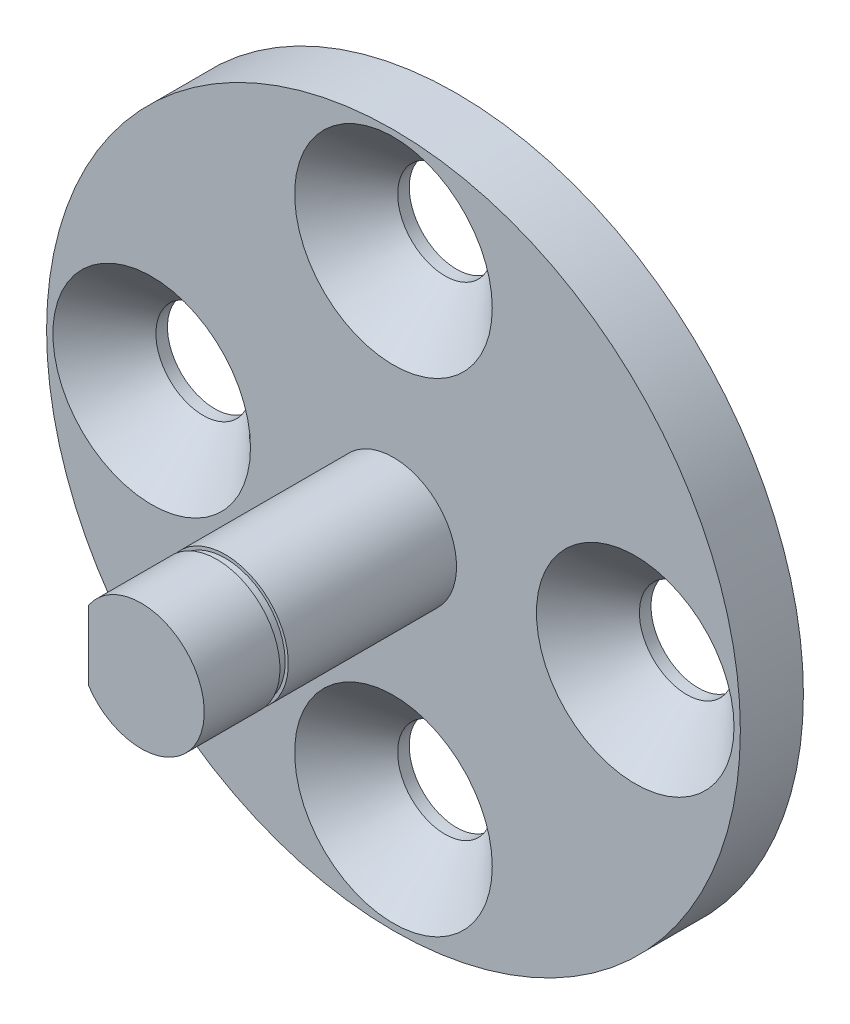
ISO-10303-21;
HEADER;
FILE_DESCRIPTION(('STEP AP214'),'2;1');
FILE_NAME('part.step','',(''),(''),'','','');
FILE_SCHEMA(('AUTOMOTIVE_DESIGN { 1 0 10303 214 1 1 1 1 }'));
ENDSEC;
DATA;
#1=APPLICATION_CONTEXT('core data for automotive mechanical design processes');
#2=APPLICATION_PROTOCOL_DEFINITION('international standard','automotive_design',2000,#1);
#3=PRODUCT_CONTEXT('',#1,'mechanical');
#4=PRODUCT('Part','Part','',(#3));
#5=PRODUCT_RELATED_PRODUCT_CATEGORY('part','',(#4));
#6=PRODUCT_DEFINITION_FORMATION('','',#4);
#7=PRODUCT_DEFINITION_CONTEXT('part definition',#1,'design');
#8=PRODUCT_DEFINITION('design','',#6,#7);
#9=PRODUCT_DEFINITION_SHAPE('','',#8);
#10=(LENGTH_UNIT() NAMED_UNIT(*) SI_UNIT(.MILLI.,.METRE.));
#11=(NAMED_UNIT(*) PLANE_ANGLE_UNIT() SI_UNIT($,.RADIAN.));
#12=(NAMED_UNIT(*) SI_UNIT($,.STERADIAN.) SOLID_ANGLE_UNIT());
#13=UNCERTAINTY_MEASURE_WITH_UNIT(LENGTH_MEASURE(1.E-05),#10,'distance_accuracy_value','');
#14=(GEOMETRIC_REPRESENTATION_CONTEXT(3) GLOBAL_UNCERTAINTY_ASSIGNED_CONTEXT((#13)) GLOBAL_UNIT_ASSIGNED_CONTEXT((#10,
#11,#12)) REPRESENTATION_CONTEXT('',''));
#15=CARTESIAN_POINT('',(0.,0.,0.));
#16=DIRECTION('',(0.,0.,1.));
#17=DIRECTION('',(1.,0.,0.));
#18=AXIS2_PLACEMENT_3D('',#15,#16,#17);
#19=CARTESIAN_POINT('',(-2.49999999999999,0.,0.645898033750314));
#20=DIRECTION('',(-1.,0.,0.));
#21=DIRECTION('',(0.,0.,1.));
#22=AXIS2_PLACEMENT_3D('',#19,#20,#21);
#23=PLANE('',#22);
#24=DIRECTION('',(0.,0.,-1.));
#25=VECTOR('',#24,1.);
#26=CARTESIAN_POINT('',(-2.5,1.36839321834042,0.));
#27=LINE('',#26,#25);
#28=CARTESIAN_POINT('',(-2.50000000000002,1.36839321834042,11.4));
#29=VERTEX_POINT('',#28);
#30=CARTESIAN_POINT('',(-2.49999999999999,1.3683932183404,11.));
#31=VERTEX_POINT('',#30);
#32=EDGE_CURVE('E12',#29,#31,#27,.T.);
#33=ORIENTED_EDGE('',*,*,#32,.T.);
#34=DIRECTION('',(0.,1.,0.));
#35=VECTOR('',#34,1.);
#36=CARTESIAN_POINT('',(-2.49999999999999,0.,11.));
#37=LINE('',#36,#35);
#38=CARTESIAN_POINT('',(-2.49999999999999,1.65831239517771,11.));
#39=VERTEX_POINT('',#38);
#40=EDGE_CURVE('E102',#31,#39,#37,.T.);
#41=ORIENTED_EDGE('',*,*,#40,.T.);
#42=DIRECTION('',(0.,0.,1.));
#43=VECTOR('',#42,1.);
#44=CARTESIAN_POINT('',(-2.49999999999999,1.65831239517771,0.645898033750314));
#45=LINE('',#44,#43);
#46=CARTESIAN_POINT('',(-2.49999999999999,1.65831239517771,3.));
#47=VERTEX_POINT('',#46);
#48=EDGE_CURVE('E156',#47,#39,#45,.T.);
#49=ORIENTED_EDGE('',*,*,#48,.F.);
#50=DIRECTION('',(0.,1.,0.));
#51=VECTOR('',#50,1.);
#52=CARTESIAN_POINT('',(-2.49999999999999,-1.65831239517768,3.));
#53=LINE('',#52,#51);
#54=CARTESIAN_POINT('',(-2.49999999999999,-1.65831239517768,3.));
#55=VERTEX_POINT('',#54);
#56=EDGE_CURVE('E112',#55,#47,#53,.T.);
#57=ORIENTED_EDGE('',*,*,#56,.F.);
#58=DIRECTION('',(0.,0.,1.));
#59=VECTOR('',#58,1.);
#60=CARTESIAN_POINT('',(-2.49999999999999,-1.65831239517768,0.645898033750307));
#61=LINE('',#60,#59);
#62=CARTESIAN_POINT('',(-2.49999999999999,-1.65831239517768,11.));
#63=VERTEX_POINT('',#62);
#64=EDGE_CURVE('E152',#55,#63,#61,.T.);
#65=ORIENTED_EDGE('',*,*,#64,.T.);
#66=CARTESIAN_POINT('',(-2.5,-1.3683932183404,11.));
#67=VERTEX_POINT('',#66);
#68=EDGE_CURVE('E104',#63,#67,#37,.T.);
#69=ORIENTED_EDGE('',*,*,#68,.T.);
#70=DIRECTION('',(0.,0.,-1.));
#71=VECTOR('',#70,1.);
#72=CARTESIAN_POINT('',(-2.5,-1.36839321834039,0.));
#73=LINE('',#72,#71);
#74=CARTESIAN_POINT('',(-2.5,-1.3683932183404,11.4));
#75=VERTEX_POINT('',#74);
#76=EDGE_CURVE('E43',#67,#75,#73,.F.);
#77=ORIENTED_EDGE('',*,*,#76,.T.);
#78=DIRECTION('',(0.,-1.,0.));
#79=VECTOR('',#78,1.);
#80=CARTESIAN_POINT('',(-2.49999999999999,0.,11.4));
#81=LINE('',#80,#79);
#82=CARTESIAN_POINT('',(-2.5,-1.65831239517768,11.4));
#83=VERTEX_POINT('',#82);
#84=EDGE_CURVE('E98',#75,#83,#81,.T.);
#85=ORIENTED_EDGE('',*,*,#84,.T.);
#86=CARTESIAN_POINT('',(-2.5,-1.65831239517771,15.));
#87=VERTEX_POINT('',#86);
#88=EDGE_CURVE('E58',#83,#87,#61,.T.);
#89=ORIENTED_EDGE('',*,*,#88,.T.);
#90=DIRECTION('',(0.,-1.,0.));
#91=VECTOR('',#90,1.);
#92=CARTESIAN_POINT('',(-2.49999999999999,0.,15.));
#93=LINE('',#92,#91);
#94=CARTESIAN_POINT('',(-2.5,1.65831239517771,15.));
#95=VERTEX_POINT('',#94);
#96=EDGE_CURVE('E150',#95,#87,#93,.T.);
#97=ORIENTED_EDGE('',*,*,#96,.F.);
#98=CARTESIAN_POINT('',(-2.50000000000002,1.65831239517773,11.4));
#99=VERTEX_POINT('',#98);
#100=EDGE_CURVE('E101',#99,#95,#45,.T.);
#101=ORIENTED_EDGE('',*,*,#100,.F.);
#102=EDGE_CURVE('E50',#99,#29,#81,.T.);
#103=ORIENTED_EDGE('',*,*,#102,.T.);
#104=EDGE_LOOP('',(#33,#41,#49,#57,#65,#69,#77,#85,#89,#97,#101,#103));
#105=FACE_BOUND('',#104,.T.);
#106=ADVANCED_FACE('F35',(#105),#23,.T.);
#107=CARTESIAN_POINT('',(0.,0.,15.));
#108=DIRECTION('',(0.,0.,-1.));
#109=DIRECTION('',(-1.,0.,0.));
#110=AXIS2_PLACEMENT_3D('',#107,#108,#109);
#111=CYLINDRICAL_SURFACE('',#110,3.);
#112=CARTESIAN_POINT('',(0.,0.,11.));
#113=DIRECTION('',(0.,0.,1.));
#114=DIRECTION('',(1.,0.,0.));
#115=AXIS2_PLACEMENT_3D('',#112,#113,#114);
#116=CIRCLE('',#115,3.);
#117=EDGE_CURVE('E169',#63,#39,#116,.T.);
#118=ORIENTED_EDGE('',*,*,#117,.F.);
#119=ORIENTED_EDGE('',*,*,#64,.F.);
#120=CARTESIAN_POINT('',(0.,0.,3.));
#121=DIRECTION('',(0.,0.,1.));
#122=DIRECTION('',(1.,0.,0.));
#123=AXIS2_PLACEMENT_3D('',#120,#121,#122);
#124=CIRCLE('',#123,3.);
#125=EDGE_CURVE('E108',#47,#55,#124,.F.);
#126=ORIENTED_EDGE('',*,*,#125,.F.);
#127=ORIENTED_EDGE('',*,*,#48,.T.);
#128=EDGE_LOOP('',(#118,#119,#126,#127));
#129=FACE_BOUND('',#128,.T.);
#130=ADVANCED_FACE('F177',(#129),#111,.T.);
#131=CARTESIAN_POINT('',(0.,0.,11.4));
#132=DIRECTION('',(0.,0.,-1.));
#133=DIRECTION('',(-1.,0.,0.));
#134=AXIS2_PLACEMENT_3D('',#131,#132,#133);
#135=CIRCLE('',#134,3.);
#136=EDGE_CURVE('E165',#99,#83,#135,.T.);
#137=ORIENTED_EDGE('',*,*,#136,.F.);
#138=ORIENTED_EDGE('',*,*,#100,.T.);
#139=CARTESIAN_POINT('',(0.,0.,15.));
#140=DIRECTION('',(0.,0.,1.));
#141=DIRECTION('',(1.,0.,0.));
#142=AXIS2_PLACEMENT_3D('',#139,#140,#141);
#143=CIRCLE('',#142,3.);
#144=EDGE_CURVE('E155',#87,#95,#143,.T.);
#145=ORIENTED_EDGE('',*,*,#144,.F.);
#146=ORIENTED_EDGE('',*,*,#88,.F.);
#147=EDGE_LOOP('',(#137,#138,#145,#146));
#148=FACE_BOUND('',#147,.T.);
#149=ADVANCED_FACE('F190',(#148),#111,.T.);
#150=CARTESIAN_POINT('',(0.,0.,3.));
#151=DIRECTION('',(0.,0.,-1.));
#152=DIRECTION('',(-1.,0.,0.));
#153=AXIS2_PLACEMENT_3D('',#150,#151,#152);
#154=CYLINDRICAL_SURFACE('',#153,16.5);
#155=CARTESIAN_POINT('',(0.,0.,3.));
#156=DIRECTION('',(0.,0.,1.));
#157=DIRECTION('',(1.,0.,0.));
#158=AXIS2_PLACEMENT_3D('',#155,#156,#157);
#159=CIRCLE('',#158,16.5);
#160=CARTESIAN_POINT('',(16.5,0.,3.));
#161=VERTEX_POINT('',#160);
#162=EDGE_CURVE('E162',#161,#161,#159,.T.);
#163=ORIENTED_EDGE('',*,*,#162,.F.);
#164=EDGE_LOOP('',(#163));
#165=FACE_BOUND('',#164,.T.);
#166=CARTESIAN_POINT('',(0.,0.,0.));
#167=DIRECTION('',(0.,0.,1.));
#168=DIRECTION('',(1.,0.,0.));
#169=AXIS2_PLACEMENT_3D('',#166,#167,#168);
#170=CIRCLE('',#169,16.5);
#171=CARTESIAN_POINT('',(16.5,0.,0.));
#172=VERTEX_POINT('',#171);
#173=EDGE_CURVE('E161',#172,#172,#170,.T.);
#174=ORIENTED_EDGE('',*,*,#173,.T.);
#175=EDGE_LOOP('',(#174));
#176=FACE_BOUND('',#175,.T.);
#177=ADVANCED_FACE('F37',(#165,#176),#154,.T.);
#178=CARTESIAN_POINT('',(0.,0.,3.));
#179=DIRECTION('',(0.,0.,1.));
#180=DIRECTION('',(1.,0.,0.));
#181=AXIS2_PLACEMENT_3D('',#178,#179,#180);
#182=PLANE('',#181);
#183=CARTESIAN_POINT('',(-11.5,0.,3.));
#184=DIRECTION('',(0.,0.,1.));
#185=DIRECTION('',(1.,0.,0.));
#186=AXIS2_PLACEMENT_3D('',#183,#184,#185);
#187=CIRCLE('',#186,4.7);
#188=CARTESIAN_POINT('',(-6.80000000000001,0.,3.));
#189=VERTEX_POINT('',#188);
#190=EDGE_CURVE('E111',#189,#189,#187,.T.);
#191=ORIENTED_EDGE('',*,*,#190,.F.);
#192=EDGE_LOOP('',(#191));
#193=FACE_BOUND('',#192,.T.);
#194=CARTESIAN_POINT('',(0.,11.5,3.));
#195=DIRECTION('',(0.,0.,1.));
#196=DIRECTION('',(1.,0.,0.));
#197=AXIS2_PLACEMENT_3D('',#194,#195,#196);
#198=CIRCLE('',#197,4.7);
#199=CARTESIAN_POINT('',(4.7,11.5,3.));
#200=VERTEX_POINT('',#199);
#201=EDGE_CURVE('E123',#200,#200,#198,.T.);
#202=ORIENTED_EDGE('',*,*,#201,.F.);
#203=EDGE_LOOP('',(#202));
#204=FACE_BOUND('',#203,.T.);
#205=CARTESIAN_POINT('',(11.5,0.,3.));
#206=DIRECTION('',(0.,0.,1.));
#207=DIRECTION('',(1.,0.,0.));
#208=AXIS2_PLACEMENT_3D('',#205,#206,#207);
#209=CIRCLE('',#208,4.7);
#210=CARTESIAN_POINT('',(16.2,0.,3.));
#211=VERTEX_POINT('',#210);
#212=EDGE_CURVE('E132',#211,#211,#209,.T.);
#213=ORIENTED_EDGE('',*,*,#212,.F.);
#214=EDGE_LOOP('',(#213));
#215=FACE_BOUND('',#214,.T.);
#216=CARTESIAN_POINT('',(0.,-11.5,3.));
#217=DIRECTION('',(0.,0.,1.));
#218=DIRECTION('',(1.,0.,0.));
#219=AXIS2_PLACEMENT_3D('',#216,#217,#218);
#220=CIRCLE('',#219,4.7);
#221=CARTESIAN_POINT('',(4.69999999999999,-11.5,3.));
#222=VERTEX_POINT('',#221);
#223=EDGE_CURVE('E141',#222,#222,#220,.T.);
#224=ORIENTED_EDGE('',*,*,#223,.F.);
#225=EDGE_LOOP('',(#224));
#226=FACE_BOUND('',#225,.T.);
#227=ORIENTED_EDGE('',*,*,#162,.T.);
#228=EDGE_LOOP('',(#227));
#229=FACE_BOUND('',#228,.T.);
#230=ORIENTED_EDGE('',*,*,#56,.T.);
#231=ORIENTED_EDGE('',*,*,#125,.T.);
#232=EDGE_LOOP('',(#230,#231));
#233=FACE_BOUND('',#232,.T.);
#234=ADVANCED_FACE('F179',(#193,#204,#215,#226,#229,#233),#182,.T.);
#235=CARTESIAN_POINT('',(0.,0.,0.));
#236=DIRECTION('',(0.,0.,1.));
#237=DIRECTION('',(1.,0.,0.));
#238=AXIS2_PLACEMENT_3D('',#235,#236,#237);
#239=PLANE('',#238);
#240=CARTESIAN_POINT('',(-11.5,0.,0.));
#241=DIRECTION('',(0.,0.,1.));
#242=DIRECTION('',(1.,0.,0.));
#243=AXIS2_PLACEMENT_3D('',#240,#241,#242);
#244=CIRCLE('',#243,2.25);
#245=CARTESIAN_POINT('',(-9.25000000000001,0.,0.));
#246=VERTEX_POINT('',#245);
#247=EDGE_CURVE('E120',#246,#246,#244,.T.);
#248=ORIENTED_EDGE('',*,*,#247,.T.);
#249=EDGE_LOOP('',(#248));
#250=FACE_BOUND('',#249,.T.);
#251=CARTESIAN_POINT('',(0.,11.5,0.));
#252=DIRECTION('',(0.,0.,1.));
#253=DIRECTION('',(1.,0.,0.));
#254=AXIS2_PLACEMENT_3D('',#251,#252,#253);
#255=CIRCLE('',#254,2.25);
#256=CARTESIAN_POINT('',(2.25,11.5,0.));
#257=VERTEX_POINT('',#256);
#258=EDGE_CURVE('E129',#257,#257,#255,.T.);
#259=ORIENTED_EDGE('',*,*,#258,.T.);
#260=EDGE_LOOP('',(#259));
#261=FACE_BOUND('',#260,.T.);
#262=CARTESIAN_POINT('',(11.5,0.,0.));
#263=DIRECTION('',(0.,0.,1.));
#264=DIRECTION('',(1.,0.,0.));
#265=AXIS2_PLACEMENT_3D('',#262,#263,#264);
#266=CIRCLE('',#265,2.25);
#267=CARTESIAN_POINT('',(13.75,0.,0.));
#268=VERTEX_POINT('',#267);
#269=EDGE_CURVE('E138',#268,#268,#266,.T.);
#270=ORIENTED_EDGE('',*,*,#269,.T.);
#271=EDGE_LOOP('',(#270));
#272=FACE_BOUND('',#271,.T.);
#273=CARTESIAN_POINT('',(0.,-11.5,0.));
#274=DIRECTION('',(0.,0.,1.));
#275=DIRECTION('',(1.,0.,0.));
#276=AXIS2_PLACEMENT_3D('',#273,#274,#275);
#277=CIRCLE('',#276,2.25);
#278=CARTESIAN_POINT('',(2.24999999999999,-11.5,0.));
#279=VERTEX_POINT('',#278);
#280=EDGE_CURVE('E147',#279,#279,#277,.T.);
#281=ORIENTED_EDGE('',*,*,#280,.T.);
#282=EDGE_LOOP('',(#281));
#283=FACE_BOUND('',#282,.T.);
#284=ORIENTED_EDGE('',*,*,#173,.F.);
#285=EDGE_LOOP('',(#284));
#286=FACE_BOUND('',#285,.T.);
#287=ADVANCED_FACE('F181',(#250,#261,#272,#283,#286),#239,.F.);
#288=CARTESIAN_POINT('',(0.,-11.5,3.));
#289=DIRECTION('',(0.,0.,1.));
#290=DIRECTION('',(1.,0.,0.));
#291=AXIS2_PLACEMENT_3D('',#288,#289,#290);
#292=CYLINDRICAL_SURFACE('',#291,2.25);
#293=ORIENTED_EDGE('',*,*,#280,.F.);
#294=EDGE_LOOP('',(#293));
#295=FACE_BOUND('',#294,.T.);
#296=CARTESIAN_POINT('',(0.,-11.5,0.549999999999995));
#297=DIRECTION('',(0.,0.,1.));
#298=DIRECTION('',(1.,0.,0.));
#299=AXIS2_PLACEMENT_3D('',#296,#297,#298);
#300=CIRCLE('',#299,2.25);
#301=CARTESIAN_POINT('',(2.24999999999999,-11.5,0.549999999999995));
#302=VERTEX_POINT('',#301);
#303=EDGE_CURVE('E144',#302,#302,#300,.T.);
#304=ORIENTED_EDGE('',*,*,#303,.T.);
#305=EDGE_LOOP('',(#304));
#306=FACE_BOUND('',#305,.T.);
#307=ADVANCED_FACE('F188',(#295,#306),#292,.F.);
#308=CARTESIAN_POINT('',(0.,-11.5,3.));
#309=DIRECTION('',(0.,0.,1.));
#310=DIRECTION('',(1.,0.,0.));
#311=AXIS2_PLACEMENT_3D('',#308,#309,#310);
#312=CONICAL_SURFACE('',#311,4.7,0.785398163397449);
#313=ORIENTED_EDGE('',*,*,#303,.F.);
#314=EDGE_LOOP('',(#313));
#315=FACE_BOUND('',#314,.T.);
#316=ORIENTED_EDGE('',*,*,#223,.T.);
#317=EDGE_LOOP('',(#316));
#318=FACE_BOUND('',#317,.T.);
#319=ADVANCED_FACE('F249',(#315,#318),#312,.F.);
#320=CARTESIAN_POINT('',(11.5,0.,3.));
#321=DIRECTION('',(0.,0.,1.));
#322=DIRECTION('',(1.,0.,0.));
#323=AXIS2_PLACEMENT_3D('',#320,#321,#322);
#324=CYLINDRICAL_SURFACE('',#323,2.25);
#325=ORIENTED_EDGE('',*,*,#269,.F.);
#326=EDGE_LOOP('',(#325));
#327=FACE_BOUND('',#326,.T.);
#328=CARTESIAN_POINT('',(11.5,0.,0.550000000000002));
#329=DIRECTION('',(0.,0.,1.));
#330=DIRECTION('',(1.,0.,0.));
#331=AXIS2_PLACEMENT_3D('',#328,#329,#330);
#332=CIRCLE('',#331,2.25);
#333=CARTESIAN_POINT('',(13.75,0.,0.550000000000002));
#334=VERTEX_POINT('',#333);
#335=EDGE_CURVE('E135',#334,#334,#332,.T.);
#336=ORIENTED_EDGE('',*,*,#335,.T.);
#337=EDGE_LOOP('',(#336));
#338=FACE_BOUND('',#337,.T.);
#339=ADVANCED_FACE('F258',(#327,#338),#324,.F.);
#340=CARTESIAN_POINT('',(11.5,0.,3.));
#341=DIRECTION('',(0.,0.,1.));
#342=DIRECTION('',(1.,0.,0.));
#343=AXIS2_PLACEMENT_3D('',#340,#341,#342);
#344=CONICAL_SURFACE('',#343,4.7,0.785398163397449);
#345=ORIENTED_EDGE('',*,*,#335,.F.);
#346=EDGE_LOOP('',(#345));
#347=FACE_BOUND('',#346,.T.);
#348=ORIENTED_EDGE('',*,*,#212,.T.);
#349=EDGE_LOOP('',(#348));
#350=FACE_BOUND('',#349,.T.);
#351=ADVANCED_FACE('F267',(#347,#350),#344,.F.);
#352=CARTESIAN_POINT('',(0.,11.5,3.));
#353=DIRECTION('',(0.,0.,1.));
#354=DIRECTION('',(1.,0.,0.));
#355=AXIS2_PLACEMENT_3D('',#352,#353,#354);
#356=CYLINDRICAL_SURFACE('',#355,2.25);
#357=ORIENTED_EDGE('',*,*,#258,.F.);
#358=EDGE_LOOP('',(#357));
#359=FACE_BOUND('',#358,.T.);
#360=CARTESIAN_POINT('',(0.,11.5,0.550000000000002));
#361=DIRECTION('',(0.,0.,1.));
#362=DIRECTION('',(1.,0.,0.));
#363=AXIS2_PLACEMENT_3D('',#360,#361,#362);
#364=CIRCLE('',#363,2.25);
#365=CARTESIAN_POINT('',(2.25,11.5,0.550000000000002));
#366=VERTEX_POINT('',#365);
#367=EDGE_CURVE('E126',#366,#366,#364,.T.);
#368=ORIENTED_EDGE('',*,*,#367,.T.);
#369=EDGE_LOOP('',(#368));
#370=FACE_BOUND('',#369,.T.);
#371=ADVANCED_FACE('F277',(#359,#370),#356,.F.);
#372=CARTESIAN_POINT('',(0.,11.5,3.));
#373=DIRECTION('',(0.,0.,1.));
#374=DIRECTION('',(1.,0.,0.));
#375=AXIS2_PLACEMENT_3D('',#372,#373,#374);
#376=CONICAL_SURFACE('',#375,4.7,0.785398163397449);
#377=ORIENTED_EDGE('',*,*,#367,.F.);
#378=EDGE_LOOP('',(#377));
#379=FACE_BOUND('',#378,.T.);
#380=ORIENTED_EDGE('',*,*,#201,.T.);
#381=EDGE_LOOP('',(#380));
#382=FACE_BOUND('',#381,.T.);
#383=ADVANCED_FACE('F287',(#379,#382),#376,.F.);
#384=CARTESIAN_POINT('',(-11.5,0.,3.));
#385=DIRECTION('',(0.,0.,1.));
#386=DIRECTION('',(1.,0.,0.));
#387=AXIS2_PLACEMENT_3D('',#384,#385,#386);
#388=CYLINDRICAL_SURFACE('',#387,2.25);
#389=ORIENTED_EDGE('',*,*,#247,.F.);
#390=EDGE_LOOP('',(#389));
#391=FACE_BOUND('',#390,.T.);
#392=CARTESIAN_POINT('',(-11.5,0.,0.550000000000002));
#393=DIRECTION('',(0.,0.,1.));
#394=DIRECTION('',(1.,0.,0.));
#395=AXIS2_PLACEMENT_3D('',#392,#393,#394);
#396=CIRCLE('',#395,2.25);
#397=CARTESIAN_POINT('',(-9.25000000000001,0.,0.550000000000002));
#398=VERTEX_POINT('',#397);
#399=EDGE_CURVE('E117',#398,#398,#396,.T.);
#400=ORIENTED_EDGE('',*,*,#399,.T.);
#401=EDGE_LOOP('',(#400));
#402=FACE_BOUND('',#401,.T.);
#403=ADVANCED_FACE('F212',(#391,#402),#388,.F.);
#404=CARTESIAN_POINT('',(-11.5,0.,3.));
#405=DIRECTION('',(0.,0.,1.));
#406=DIRECTION('',(1.,0.,0.));
#407=AXIS2_PLACEMENT_3D('',#404,#405,#406);
#408=CONICAL_SURFACE('',#407,4.7,0.785398163397449);
#409=ORIENTED_EDGE('',*,*,#399,.F.);
#410=EDGE_LOOP('',(#409));
#411=FACE_BOUND('',#410,.T.);
#412=ORIENTED_EDGE('',*,*,#190,.T.);
#413=EDGE_LOOP('',(#412));
#414=FACE_BOUND('',#413,.T.);
#415=ADVANCED_FACE('F205',(#411,#414),#408,.F.);
#416=CARTESIAN_POINT('',(0.,0.,15.));
#417=DIRECTION('',(0.,0.,1.));
#418=DIRECTION('',(1.,0.,0.));
#419=AXIS2_PLACEMENT_3D('',#416,#417,#418);
#420=PLANE('',#419);
#421=ORIENTED_EDGE('',*,*,#144,.T.);
#422=ORIENTED_EDGE('',*,*,#96,.T.);
#423=EDGE_LOOP('',(#421,#422));
#424=FACE_BOUND('',#423,.T.);
#425=ADVANCED_FACE('F203',(#424),#420,.T.);
#426=CARTESIAN_POINT('',(0.,0.,0.));
#427=DIRECTION('',(0.,0.,-1.));
#428=DIRECTION('',(-1.,0.,0.));
#429=AXIS2_PLACEMENT_3D('',#426,#427,#428);
#430=CYLINDRICAL_SURFACE('',#429,2.85);
#431=CARTESIAN_POINT('',(0.,0.,11.4));
#432=DIRECTION('',(0.,0.,-1.));
#433=DIRECTION('',(-1.,0.,0.));
#434=AXIS2_PLACEMENT_3D('',#431,#432,#433);
#435=CIRCLE('',#434,2.85);
#436=EDGE_CURVE('E92',#29,#75,#435,.T.);
#437=ORIENTED_EDGE('',*,*,#436,.T.);
#438=ORIENTED_EDGE('',*,*,#76,.F.);
#439=CARTESIAN_POINT('',(0.,0.,11.));
#440=DIRECTION('',(0.,0.,-1.));
#441=DIRECTION('',(-1.,0.,0.));
#442=AXIS2_PLACEMENT_3D('',#439,#440,#441);
#443=CIRCLE('',#442,2.85);
#444=EDGE_CURVE('E95',#31,#67,#443,.T.);
#445=ORIENTED_EDGE('',*,*,#444,.F.);
#446=ORIENTED_EDGE('',*,*,#32,.F.);
#447=EDGE_LOOP('',(#437,#438,#445,#446));
#448=FACE_BOUND('',#447,.T.);
#449=ADVANCED_FACE('F91',(#448),#430,.T.);
#450=CARTESIAN_POINT('',(3.15,0.,11.));
#451=DIRECTION('',(0.,0.,1.));
#452=DIRECTION('',(1.,0.,0.));
#453=AXIS2_PLACEMENT_3D('',#450,#451,#452);
#454=PLANE('',#453);
#455=ORIENTED_EDGE('',*,*,#117,.T.);
#456=ORIENTED_EDGE('',*,*,#40,.F.);
#457=ORIENTED_EDGE('',*,*,#444,.T.);
#458=ORIENTED_EDGE('',*,*,#68,.F.);
#459=EDGE_LOOP('',(#455,#456,#457,#458));
#460=FACE_BOUND('',#459,.T.);
#461=ADVANCED_FACE('F172',(#460),#454,.T.);
#462=CARTESIAN_POINT('',(3.15,0.,11.4));
#463=DIRECTION('',(0.,0.,-1.));
#464=DIRECTION('',(-1.,0.,0.));
#465=AXIS2_PLACEMENT_3D('',#462,#463,#464);
#466=PLANE('',#465);
#467=ORIENTED_EDGE('',*,*,#136,.T.);
#468=ORIENTED_EDGE('',*,*,#84,.F.);
#469=ORIENTED_EDGE('',*,*,#436,.F.);
#470=ORIENTED_EDGE('',*,*,#102,.F.);
#471=EDGE_LOOP('',(#467,#468,#469,#470));
#472=FACE_BOUND('',#471,.T.);
#473=ADVANCED_FACE('F97',(#472),#466,.T.);
#474=CLOSED_SHELL('',(#106,#130,#149,#177,#234,#287,#307,#319,#339,#351,#371,#383,#403,#415,
#425,#449,#461,#473));
#475=MANIFOLD_SOLID_BREP('B2',#474);
#476=ADVANCED_BREP_SHAPE_REPRESENTATION('',(#18,#475),#14);
#477=SHAPE_DEFINITION_REPRESENTATION(#9,#476);
ENDSEC;
END-ISO-10303-21;
